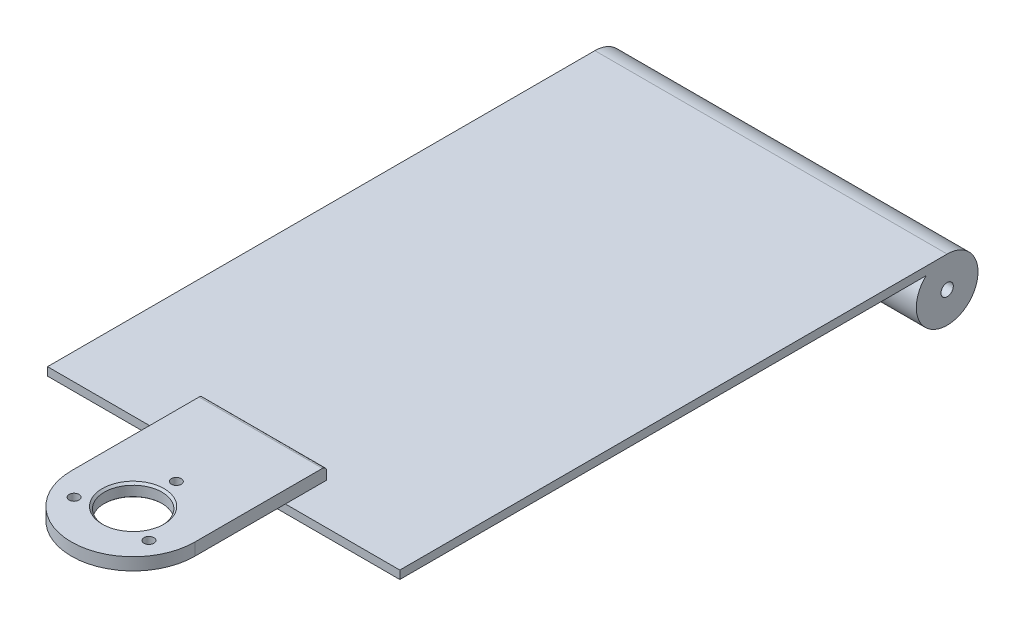
ISO-10303-21;
HEADER;
FILE_DESCRIPTION(('STEP AP214'),'2;1');
FILE_NAME('part.step','',(''),(''),'','','');
FILE_SCHEMA(('AUTOMOTIVE_DESIGN { 1 0 10303 214 1 1 1 1 }'));
ENDSEC;
DATA;
#1=APPLICATION_CONTEXT('core data for automotive mechanical design processes');
#2=APPLICATION_PROTOCOL_DEFINITION('international standard','automotive_design',2000,#1);
#3=PRODUCT_CONTEXT('',#1,'mechanical');
#4=PRODUCT('Part','Part','',(#3));
#5=PRODUCT_RELATED_PRODUCT_CATEGORY('part','',(#4));
#6=PRODUCT_DEFINITION_FORMATION('','',#4);
#7=PRODUCT_DEFINITION_CONTEXT('part definition',#1,'design');
#8=PRODUCT_DEFINITION('design','',#6,#7);
#9=PRODUCT_DEFINITION_SHAPE('','',#8);
#10=(LENGTH_UNIT() NAMED_UNIT(*) SI_UNIT(.MILLI.,.METRE.));
#11=(NAMED_UNIT(*) PLANE_ANGLE_UNIT() SI_UNIT($,.RADIAN.));
#12=(NAMED_UNIT(*) SI_UNIT($,.STERADIAN.) SOLID_ANGLE_UNIT());
#13=UNCERTAINTY_MEASURE_WITH_UNIT(LENGTH_MEASURE(1.E-05),#10,'distance_accuracy_value','');
#14=(GEOMETRIC_REPRESENTATION_CONTEXT(3) GLOBAL_UNCERTAINTY_ASSIGNED_CONTEXT((#13)) GLOBAL_UNIT_ASSIGNED_CONTEXT((#10,
#11,#12)) REPRESENTATION_CONTEXT('',''));
#15=CARTESIAN_POINT('',(0.,0.,0.));
#16=DIRECTION('',(0.,0.,1.));
#17=DIRECTION('',(1.,0.,0.));
#18=AXIS2_PLACEMENT_3D('',#15,#16,#17);
#19=CARTESIAN_POINT('',(42.8,7.5,0.));
#20=DIRECTION('',(0.,-1.,0.));
#21=DIRECTION('',(0.,0.,-1.));
#22=AXIS2_PLACEMENT_3D('',#19,#20,#21);
#23=PLANE('',#22);
#24=DIRECTION('',(0.,0.,-1.));
#25=VECTOR('',#24,1.);
#26=CARTESIAN_POINT('',(15.,7.49999999999998,133.));
#27=LINE('',#26,#25);
#28=CARTESIAN_POINT('',(15.,7.49999999999998,133.));
#29=VERTEX_POINT('',#28);
#30=CARTESIAN_POINT('',(15.,7.5,123.));
#31=VERTEX_POINT('',#30);
#32=EDGE_CURVE('E134',#29,#31,#27,.T.);
#33=ORIENTED_EDGE('',*,*,#32,.F.);
#34=DIRECTION('',(-1.,0.,0.));
#35=VECTOR('',#34,1.);
#36=CARTESIAN_POINT('',(42.8,7.49999999999998,133.));
#37=LINE('',#36,#35);
#38=CARTESIAN_POINT('',(42.8,7.49999999999998,133.));
#39=VERTEX_POINT('',#38);
#40=EDGE_CURVE('E43',#39,#29,#37,.T.);
#41=ORIENTED_EDGE('',*,*,#40,.F.);
#42=DIRECTION('',(0.,0.,1.));
#43=VECTOR('',#42,1.);
#44=CARTESIAN_POINT('',(42.8,7.5,0.));
#45=LINE('',#44,#43);
#46=CARTESIAN_POINT('',(42.8,7.5,0.));
#47=VERTEX_POINT('',#46);
#48=EDGE_CURVE('E87',#47,#39,#45,.T.);
#49=ORIENTED_EDGE('',*,*,#48,.F.);
#50=DIRECTION('',(-1.,0.,0.));
#51=VECTOR('',#50,1.);
#52=CARTESIAN_POINT('',(42.8,7.5,0.));
#53=LINE('',#52,#51);
#54=CARTESIAN_POINT('',(-42.8,7.5,0.));
#55=VERTEX_POINT('',#54);
#56=EDGE_CURVE('E11',#47,#55,#53,.T.);
#57=ORIENTED_EDGE('',*,*,#56,.T.);
#58=DIRECTION('',(0.,0.,1.));
#59=VECTOR('',#58,1.);
#60=CARTESIAN_POINT('',(-42.8,7.5,0.));
#61=LINE('',#60,#59);
#62=CARTESIAN_POINT('',(-42.8,7.49999999999998,133.));
#63=VERTEX_POINT('',#62);
#64=EDGE_CURVE('E187',#55,#63,#61,.T.);
#65=ORIENTED_EDGE('',*,*,#64,.T.);
#66=CARTESIAN_POINT('',(-15.,7.49999999999998,133.));
#67=VERTEX_POINT('',#66);
#68=EDGE_CURVE('E195',#67,#63,#37,.T.);
#69=ORIENTED_EDGE('',*,*,#68,.F.);
#70=DIRECTION('',(0.,0.,1.));
#71=VECTOR('',#70,1.);
#72=CARTESIAN_POINT('',(-15.,7.49999999999998,133.));
#73=LINE('',#72,#71);
#74=CARTESIAN_POINT('',(-15.,7.5,123.));
#75=VERTEX_POINT('',#74);
#76=EDGE_CURVE('E151',#75,#67,#73,.T.);
#77=ORIENTED_EDGE('',*,*,#76,.F.);
#78=DIRECTION('',(1.,0.,0.));
#79=VECTOR('',#78,1.);
#80=CARTESIAN_POINT('',(-25.4403065089106,7.5,123.));
#81=LINE('',#80,#79);
#82=EDGE_CURVE('E166',#75,#31,#81,.T.);
#83=ORIENTED_EDGE('',*,*,#82,.T.);
#84=EDGE_LOOP('',(#33,#41,#49,#57,#65,#69,#77,#83));
#85=FACE_BOUND('',#84,.T.);
#86=ADVANCED_FACE('F35',(#85),#23,.F.);
#87=CARTESIAN_POINT('',(42.8,0.,0.));
#88=DIRECTION('',(1.,0.,0.));
#89=DIRECTION('',(0.,0.,-1.));
#90=AXIS2_PLACEMENT_3D('',#87,#88,#89);
#91=PLANE('',#90);
#92=CARTESIAN_POINT('',(42.8,0.,0.));
#93=DIRECTION('',(1.,0.,0.));
#94=DIRECTION('',(0.,0.,-1.));
#95=AXIS2_PLACEMENT_3D('',#92,#93,#94);
#96=CIRCLE('',#95,7.5);
#97=CARTESIAN_POINT('',(42.8,5.49999999999999,5.09901951359279));
#98=VERTEX_POINT('',#97);
#99=EDGE_CURVE('E178',#98,#47,#96,.T.);
#100=ORIENTED_EDGE('',*,*,#99,.T.);
#101=ORIENTED_EDGE('',*,*,#48,.T.);
#102=DIRECTION('',(0.,-1.,0.));
#103=VECTOR('',#102,1.);
#104=CARTESIAN_POINT('',(42.8,7.49999999999998,133.));
#105=LINE('',#104,#103);
#106=CARTESIAN_POINT('',(42.8,5.49999999999998,133.));
#107=VERTEX_POINT('',#106);
#108=EDGE_CURVE('E181',#39,#107,#105,.T.);
#109=ORIENTED_EDGE('',*,*,#108,.T.);
#110=DIRECTION('',(0.,0.,-1.));
#111=VECTOR('',#110,1.);
#112=CARTESIAN_POINT('',(42.8,5.49999999999998,133.));
#113=LINE('',#112,#111);
#114=EDGE_CURVE('E59',#107,#98,#113,.T.);
#115=ORIENTED_EDGE('',*,*,#114,.T.);
#116=EDGE_LOOP('',(#100,#101,#109,#115));
#117=FACE_BOUND('',#116,.T.);
#118=CARTESIAN_POINT('',(42.8,0.,0.));
#119=DIRECTION('',(1.,0.,0.));
#120=DIRECTION('',(0.,0.,-1.));
#121=AXIS2_PLACEMENT_3D('',#118,#119,#120);
#122=CIRCLE('',#121,1.5);
#123=CARTESIAN_POINT('',(42.8,0.,-1.5));
#124=VERTEX_POINT('',#123);
#125=EDGE_CURVE('E172',#124,#124,#122,.T.);
#126=ORIENTED_EDGE('',*,*,#125,.F.);
#127=EDGE_LOOP('',(#126));
#128=FACE_BOUND('',#127,.T.);
#129=ADVANCED_FACE('F214',(#117,#128),#91,.T.);
#130=CARTESIAN_POINT('',(-42.8,0.,0.));
#131=DIRECTION('',(1.,0.,0.));
#132=DIRECTION('',(0.,0.,-1.));
#133=AXIS2_PLACEMENT_3D('',#130,#131,#132);
#134=PLANE('',#133);
#135=CARTESIAN_POINT('',(-42.8,0.,0.));
#136=DIRECTION('',(1.,0.,0.));
#137=DIRECTION('',(0.,0.,-1.));
#138=AXIS2_PLACEMENT_3D('',#135,#136,#137);
#139=CIRCLE('',#138,7.5);
#140=CARTESIAN_POINT('',(-42.8,5.49999999999999,5.09901951359279));
#141=VERTEX_POINT('',#140);
#142=EDGE_CURVE('E175',#141,#55,#139,.T.);
#143=ORIENTED_EDGE('',*,*,#142,.F.);
#144=DIRECTION('',(0.,0.,-1.));
#145=VECTOR('',#144,1.);
#146=CARTESIAN_POINT('',(-42.8,5.49999999999998,133.));
#147=LINE('',#146,#145);
#148=CARTESIAN_POINT('',(-42.8,5.49999999999998,133.));
#149=VERTEX_POINT('',#148);
#150=EDGE_CURVE('E80',#149,#141,#147,.T.);
#151=ORIENTED_EDGE('',*,*,#150,.F.);
#152=DIRECTION('',(0.,-1.,0.));
#153=VECTOR('',#152,1.);
#154=CARTESIAN_POINT('',(-42.8,7.49999999999998,133.));
#155=LINE('',#154,#153);
#156=EDGE_CURVE('E190',#63,#149,#155,.T.);
#157=ORIENTED_EDGE('',*,*,#156,.F.);
#158=ORIENTED_EDGE('',*,*,#64,.F.);
#159=EDGE_LOOP('',(#143,#151,#157,#158));
#160=FACE_BOUND('',#159,.T.);
#161=CARTESIAN_POINT('',(-42.8,0.,0.));
#162=DIRECTION('',(1.,0.,0.));
#163=DIRECTION('',(0.,0.,-1.));
#164=AXIS2_PLACEMENT_3D('',#161,#162,#163);
#165=CIRCLE('',#164,1.5);
#166=CARTESIAN_POINT('',(-42.8,0.,-1.5));
#167=VERTEX_POINT('',#166);
#168=EDGE_CURVE('E159',#167,#167,#165,.T.);
#169=ORIENTED_EDGE('',*,*,#168,.T.);
#170=EDGE_LOOP('',(#169));
#171=FACE_BOUND('',#170,.T.);
#172=ADVANCED_FACE('F209',(#160,#171),#134,.F.);
#173=CARTESIAN_POINT('',(42.8,0.,0.));
#174=DIRECTION('',(-1.,0.,0.));
#175=DIRECTION('',(0.,0.,1.));
#176=AXIS2_PLACEMENT_3D('',#173,#174,#175);
#177=CYLINDRICAL_SURFACE('',#176,7.5);
#178=ORIENTED_EDGE('',*,*,#142,.T.);
#179=ORIENTED_EDGE('',*,*,#56,.F.);
#180=ORIENTED_EDGE('',*,*,#99,.F.);
#181=DIRECTION('',(-1.,0.,0.));
#182=VECTOR('',#181,1.);
#183=CARTESIAN_POINT('',(42.8,5.49999999999999,5.09901951359279));
#184=LINE('',#183,#182);
#185=EDGE_CURVE('E184',#98,#141,#184,.T.);
#186=ORIENTED_EDGE('',*,*,#185,.T.);
#187=EDGE_LOOP('',(#178,#179,#180,#186));
#188=FACE_BOUND('',#187,.T.);
#189=ADVANCED_FACE('F37',(#188),#177,.T.);
#190=CARTESIAN_POINT('',(42.8,7.49999999999998,133.));
#191=DIRECTION('',(0.,0.,-1.));
#192=DIRECTION('',(-1.,0.,0.));
#193=AXIS2_PLACEMENT_3D('',#190,#191,#192);
#194=PLANE('',#193);
#195=ORIENTED_EDGE('',*,*,#40,.T.);
#196=DIRECTION('',(-1.,0.,0.));
#197=VECTOR('',#196,1.);
#198=CARTESIAN_POINT('',(15.,7.49999999999998,133.));
#199=LINE('',#198,#197);
#200=EDGE_CURVE('E203',#29,#67,#199,.T.);
#201=ORIENTED_EDGE('',*,*,#200,.T.);
#202=ORIENTED_EDGE('',*,*,#68,.T.);
#203=ORIENTED_EDGE('',*,*,#156,.T.);
#204=DIRECTION('',(-1.,0.,0.));
#205=VECTOR('',#204,1.);
#206=CARTESIAN_POINT('',(42.8,5.49999999999998,133.));
#207=LINE('',#206,#205);
#208=EDGE_CURVE('E194',#107,#149,#207,.T.);
#209=ORIENTED_EDGE('',*,*,#208,.F.);
#210=ORIENTED_EDGE('',*,*,#108,.F.);
#211=EDGE_LOOP('',(#195,#201,#202,#203,#209,#210));
#212=FACE_BOUND('',#211,.T.);
#213=ADVANCED_FACE('F200',(#212),#194,.F.);
#214=CARTESIAN_POINT('',(42.8,5.49999999999998,133.));
#215=DIRECTION('',(0.,1.,0.));
#216=DIRECTION('',(0.,0.,1.));
#217=AXIS2_PLACEMENT_3D('',#214,#215,#216);
#218=PLANE('',#217);
#219=ORIENTED_EDGE('',*,*,#150,.T.);
#220=ORIENTED_EDGE('',*,*,#185,.F.);
#221=ORIENTED_EDGE('',*,*,#114,.F.);
#222=ORIENTED_EDGE('',*,*,#208,.T.);
#223=EDGE_LOOP('',(#219,#220,#221,#222));
#224=FACE_BOUND('',#223,.T.);
#225=ADVANCED_FACE('F213',(#224),#218,.F.);
#226=CARTESIAN_POINT('',(42.8,0.,0.));
#227=DIRECTION('',(-1.,0.,0.));
#228=DIRECTION('',(0.,0.,1.));
#229=AXIS2_PLACEMENT_3D('',#226,#227,#228);
#230=CYLINDRICAL_SURFACE('',#229,1.5);
#231=ORIENTED_EDGE('',*,*,#125,.T.);
#232=EDGE_LOOP('',(#231));
#233=FACE_BOUND('',#232,.T.);
#234=ORIENTED_EDGE('',*,*,#168,.F.);
#235=EDGE_LOOP('',(#234));
#236=FACE_BOUND('',#235,.T.);
#237=ADVANCED_FACE('F309',(#233,#236),#230,.F.);
#238=CARTESIAN_POINT('',(-25.4403065089106,10.5,133.));
#239=DIRECTION('',(0.,1.,0.));
#240=DIRECTION('',(0.,0.,1.));
#241=AXIS2_PLACEMENT_3D('',#238,#239,#240);
#242=PLANE('',#241);
#243=CARTESIAN_POINT('',(0.,10.5,155.));
#244=DIRECTION('',(0.,-1.,0.));
#245=DIRECTION('',(0.,0.,-1.));
#246=AXIS2_PLACEMENT_3D('',#243,#244,#245);
#247=CIRCLE('',#246,7.50000000000001);
#248=CARTESIAN_POINT('',(0.,10.5,147.5));
#249=VERTEX_POINT('',#248);
#250=EDGE_CURVE('E255',#249,#249,#247,.T.);
#251=ORIENTED_EDGE('',*,*,#250,.T.);
#252=EDGE_LOOP('',(#251));
#253=FACE_BOUND('',#252,.T.);
#254=CARTESIAN_POINT('',(0.,10.5,144.5));
#255=DIRECTION('',(0.,1.,0.));
#256=DIRECTION('',(0.,0.,1.));
#257=AXIS2_PLACEMENT_3D('',#254,#255,#256);
#258=CIRCLE('',#257,1.2);
#259=CARTESIAN_POINT('',(0.,10.5,145.7));
#260=VERTEX_POINT('',#259);
#261=EDGE_CURVE('E222',#260,#260,#258,.T.);
#262=ORIENTED_EDGE('',*,*,#261,.F.);
#263=EDGE_LOOP('',(#262));
#264=FACE_BOUND('',#263,.T.);
#265=CARTESIAN_POINT('',(9.09326673973704,10.5,160.25));
#266=DIRECTION('',(0.,1.,0.));
#267=DIRECTION('',(0.,0.,1.));
#268=AXIS2_PLACEMENT_3D('',#265,#266,#267);
#269=CIRCLE('',#268,1.19999999999999);
#270=CARTESIAN_POINT('',(9.09326673973704,10.5,161.45));
#271=VERTEX_POINT('',#270);
#272=EDGE_CURVE('E227',#271,#271,#269,.T.);
#273=ORIENTED_EDGE('',*,*,#272,.F.);
#274=EDGE_LOOP('',(#273));
#275=FACE_BOUND('',#274,.T.);
#276=CARTESIAN_POINT('',(-9.0932667397362,10.5,160.25));
#277=DIRECTION('',(0.,1.,0.));
#278=DIRECTION('',(0.,0.,1.));
#279=AXIS2_PLACEMENT_3D('',#276,#277,#278);
#280=CIRCLE('',#279,1.20000000000001);
#281=CARTESIAN_POINT('',(-9.0932667397362,10.5,161.45));
#282=VERTEX_POINT('',#281);
#283=EDGE_CURVE('E224',#282,#282,#280,.T.);
#284=ORIENTED_EDGE('',*,*,#283,.F.);
#285=EDGE_LOOP('',(#284));
#286=FACE_BOUND('',#285,.T.);
#287=DIRECTION('',(0.,0.,-1.));
#288=VECTOR('',#287,1.);
#289=CARTESIAN_POINT('',(-15.,10.5,133.));
#290=LINE('',#289,#288);
#291=CARTESIAN_POINT('',(-15.,10.5,155.));
#292=VERTEX_POINT('',#291);
#293=CARTESIAN_POINT('',(-15.,10.5,124.));
#294=VERTEX_POINT('',#293);
#295=EDGE_CURVE('E139',#292,#294,#290,.T.);
#296=ORIENTED_EDGE('',*,*,#295,.F.);
#297=CARTESIAN_POINT('',(0.,10.5,155.));
#298=DIRECTION('',(0.,1.,0.));
#299=DIRECTION('',(0.,0.,1.));
#300=AXIS2_PLACEMENT_3D('',#297,#298,#299);
#301=CIRCLE('',#300,15.);
#302=CARTESIAN_POINT('',(15.,10.5,155.));
#303=VERTEX_POINT('',#302);
#304=EDGE_CURVE('E137',#292,#303,#301,.T.);
#305=ORIENTED_EDGE('',*,*,#304,.T.);
#306=DIRECTION('',(0.,0.,1.));
#307=VECTOR('',#306,1.);
#308=CARTESIAN_POINT('',(15.,10.5,133.));
#309=LINE('',#308,#307);
#310=CARTESIAN_POINT('',(15.,10.5,124.));
#311=VERTEX_POINT('',#310);
#312=EDGE_CURVE('E123',#311,#303,#309,.T.);
#313=ORIENTED_EDGE('',*,*,#312,.F.);
#314=DIRECTION('',(1.,0.,0.));
#315=VECTOR('',#314,1.);
#316=CARTESIAN_POINT('',(-25.4403065089106,10.5,124.));
#317=LINE('',#316,#315);
#318=EDGE_CURVE('E155',#294,#311,#317,.T.);
#319=ORIENTED_EDGE('',*,*,#318,.F.);
#320=EDGE_LOOP('',(#296,#305,#313,#319));
#321=FACE_BOUND('',#320,.T.);
#322=ADVANCED_FACE('F138',(#253,#264,#275,#286,#321),#242,.T.);
#323=CARTESIAN_POINT('',(-25.4403065089106,9.49999999999998,124.));
#324=DIRECTION('',(1.,0.,0.));
#325=DIRECTION('',(0.,0.,-1.));
#326=AXIS2_PLACEMENT_3D('',#323,#324,#325);
#327=CYLINDRICAL_SURFACE('',#326,1.);
#328=CARTESIAN_POINT('',(-15.,9.49999999999998,124.));
#329=DIRECTION('',(1.,0.,0.));
#330=DIRECTION('',(0.,0.,-1.));
#331=AXIS2_PLACEMENT_3D('',#328,#329,#330);
#332=CIRCLE('',#331,1.);
#333=CARTESIAN_POINT('',(-15.,9.49999999999998,123.));
#334=VERTEX_POINT('',#333);
#335=EDGE_CURVE('E157',#294,#334,#332,.F.);
#336=ORIENTED_EDGE('',*,*,#335,.F.);
#337=ORIENTED_EDGE('',*,*,#318,.T.);
#338=CARTESIAN_POINT('',(15.,9.49999999999998,124.));
#339=DIRECTION('',(1.,0.,0.));
#340=DIRECTION('',(0.,0.,1.));
#341=AXIS2_PLACEMENT_3D('',#338,#339,#340);
#342=CIRCLE('',#341,1.);
#343=CARTESIAN_POINT('',(15.,9.49999999999998,123.));
#344=VERTEX_POINT('',#343);
#345=EDGE_CURVE('E131',#344,#311,#342,.T.);
#346=ORIENTED_EDGE('',*,*,#345,.F.);
#347=DIRECTION('',(1.,0.,0.));
#348=VECTOR('',#347,1.);
#349=CARTESIAN_POINT('',(-25.4403065089106,9.49999999999998,123.));
#350=LINE('',#349,#348);
#351=EDGE_CURVE('E168',#334,#344,#350,.T.);
#352=ORIENTED_EDGE('',*,*,#351,.F.);
#353=EDGE_LOOP('',(#336,#337,#346,#352));
#354=FACE_BOUND('',#353,.T.);
#355=ADVANCED_FACE('F317',(#354),#327,.T.);
#356=CARTESIAN_POINT('',(-25.4403065089106,9.49999999999998,123.));
#357=DIRECTION('',(0.,0.,-1.));
#358=DIRECTION('',(-1.,0.,0.));
#359=AXIS2_PLACEMENT_3D('',#356,#357,#358);
#360=PLANE('',#359);
#361=DIRECTION('',(0.,-1.,0.));
#362=VECTOR('',#361,1.);
#363=CARTESIAN_POINT('',(-15.,9.49999999999998,123.));
#364=LINE('',#363,#362);
#365=EDGE_CURVE('E154',#334,#75,#364,.T.);
#366=ORIENTED_EDGE('',*,*,#365,.F.);
#367=ORIENTED_EDGE('',*,*,#351,.T.);
#368=DIRECTION('',(0.,1.,0.));
#369=VECTOR('',#368,1.);
#370=CARTESIAN_POINT('',(15.,9.49999999999998,123.));
#371=LINE('',#370,#369);
#372=EDGE_CURVE('E163',#31,#344,#371,.T.);
#373=ORIENTED_EDGE('',*,*,#372,.F.);
#374=ORIENTED_EDGE('',*,*,#82,.F.);
#375=EDGE_LOOP('',(#366,#367,#373,#374));
#376=FACE_BOUND('',#375,.T.);
#377=ADVANCED_FACE('F319',(#376),#360,.T.);
#378=CARTESIAN_POINT('',(15.,9.49999999999998,124.));
#379=DIRECTION('',(-1.,0.,0.));
#380=DIRECTION('',(0.,0.,1.));
#381=AXIS2_PLACEMENT_3D('',#378,#379,#380);
#382=PLANE('',#381);
#383=ORIENTED_EDGE('',*,*,#312,.T.);
#384=DIRECTION('',(0.,-1.,0.));
#385=VECTOR('',#384,1.);
#386=CARTESIAN_POINT('',(15.,10.5,155.));
#387=LINE('',#386,#385);
#388=CARTESIAN_POINT('',(15.,7.49999999999998,155.));
#389=VERTEX_POINT('',#388);
#390=EDGE_CURVE('E127',#303,#389,#387,.T.);
#391=ORIENTED_EDGE('',*,*,#390,.T.);
#392=DIRECTION('',(0.,0.,-1.));
#393=VECTOR('',#392,1.);
#394=CARTESIAN_POINT('',(15.,7.49999999999998,155.));
#395=LINE('',#394,#393);
#396=EDGE_CURVE('E217',#389,#29,#395,.T.);
#397=ORIENTED_EDGE('',*,*,#396,.T.);
#398=ORIENTED_EDGE('',*,*,#32,.T.);
#399=ORIENTED_EDGE('',*,*,#372,.T.);
#400=ORIENTED_EDGE('',*,*,#345,.T.);
#401=EDGE_LOOP('',(#383,#391,#397,#398,#399,#400));
#402=FACE_BOUND('',#401,.T.);
#403=ADVANCED_FACE('F125',(#402),#382,.F.);
#404=CARTESIAN_POINT('',(-15.,10.5,133.));
#405=DIRECTION('',(1.,0.,0.));
#406=DIRECTION('',(0.,0.,-1.));
#407=AXIS2_PLACEMENT_3D('',#404,#405,#406);
#408=PLANE('',#407);
#409=ORIENTED_EDGE('',*,*,#295,.T.);
#410=ORIENTED_EDGE('',*,*,#335,.T.);
#411=ORIENTED_EDGE('',*,*,#365,.T.);
#412=ORIENTED_EDGE('',*,*,#76,.T.);
#413=DIRECTION('',(0.,0.,1.));
#414=VECTOR('',#413,1.);
#415=CARTESIAN_POINT('',(-15.,7.49999999999998,133.));
#416=LINE('',#415,#414);
#417=CARTESIAN_POINT('',(-15.,7.49999999999998,155.));
#418=VERTEX_POINT('',#417);
#419=EDGE_CURVE('E50',#67,#418,#416,.T.);
#420=ORIENTED_EDGE('',*,*,#419,.T.);
#421=DIRECTION('',(0.,-1.,0.));
#422=VECTOR('',#421,1.);
#423=CARTESIAN_POINT('',(-15.,10.5,155.));
#424=LINE('',#423,#422);
#425=EDGE_CURVE('E143',#292,#418,#424,.T.);
#426=ORIENTED_EDGE('',*,*,#425,.F.);
#427=EDGE_LOOP('',(#409,#410,#411,#412,#420,#426));
#428=FACE_BOUND('',#427,.T.);
#429=ADVANCED_FACE('F328',(#428),#408,.F.);
#430=CARTESIAN_POINT('',(0.,10.5,155.));
#431=DIRECTION('',(0.,-1.,0.));
#432=DIRECTION('',(0.,0.,-1.));
#433=AXIS2_PLACEMENT_3D('',#430,#431,#432);
#434=CYLINDRICAL_SURFACE('',#433,15.);
#435=CARTESIAN_POINT('',(0.,7.49999999999998,155.));
#436=DIRECTION('',(0.,1.,0.));
#437=DIRECTION('',(0.,0.,1.));
#438=AXIS2_PLACEMENT_3D('',#435,#436,#437);
#439=CIRCLE('',#438,15.);
#440=EDGE_CURVE('E146',#418,#389,#439,.T.);
#441=ORIENTED_EDGE('',*,*,#440,.T.);
#442=ORIENTED_EDGE('',*,*,#390,.F.);
#443=ORIENTED_EDGE('',*,*,#304,.F.);
#444=ORIENTED_EDGE('',*,*,#425,.T.);
#445=EDGE_LOOP('',(#441,#442,#443,#444));
#446=FACE_BOUND('',#445,.T.);
#447=ADVANCED_FACE('F145',(#446),#434,.T.);
#448=CARTESIAN_POINT('',(0.,7.49999999999998,155.));
#449=DIRECTION('',(0.,1.,0.));
#450=DIRECTION('',(0.,0.,1.));
#451=AXIS2_PLACEMENT_3D('',#448,#449,#450);
#452=PLANE('',#451);
#453=CARTESIAN_POINT('',(0.,7.49999999999998,155.));
#454=DIRECTION('',(0.,-1.,0.));
#455=DIRECTION('',(0.,0.,-1.));
#456=AXIS2_PLACEMENT_3D('',#453,#454,#455);
#457=CIRCLE('',#456,7.1);
#458=CARTESIAN_POINT('',(0.,7.49999999999998,147.9));
#459=VERTEX_POINT('',#458);
#460=EDGE_CURVE('E250',#459,#459,#457,.T.);
#461=ORIENTED_EDGE('',*,*,#460,.F.);
#462=EDGE_LOOP('',(#461));
#463=FACE_BOUND('',#462,.T.);
#464=CARTESIAN_POINT('',(9.09326673973665,7.49999999999998,160.25));
#465=DIRECTION('',(0.,1.,0.));
#466=DIRECTION('',(-0.866025403784443,0.,-0.499999999999992));
#467=AXIS2_PLACEMENT_3D('',#464,#465,#466);
#468=CIRCLE('',#467,2.5);
#469=CARTESIAN_POINT('',(6.92820323027554,7.49999999999998,159.));
#470=VERTEX_POINT('',#469);
#471=EDGE_CURVE('E244',#470,#470,#468,.T.);
#472=ORIENTED_EDGE('',*,*,#471,.T.);
#473=EDGE_LOOP('',(#472));
#474=FACE_BOUND('',#473,.T.);
#475=CARTESIAN_POINT('',(-9.09326673973659,7.49999999999998,160.25));
#476=DIRECTION('',(0.,1.,0.));
#477=DIRECTION('',(0.866025403784436,0.,-0.500000000000004));
#478=AXIS2_PLACEMENT_3D('',#475,#476,#477);
#479=CIRCLE('',#478,2.5);
#480=CARTESIAN_POINT('',(-6.9282032302755,7.49999999999998,159.));
#481=VERTEX_POINT('',#480);
#482=EDGE_CURVE('E238',#481,#481,#479,.T.);
#483=ORIENTED_EDGE('',*,*,#482,.T.);
#484=EDGE_LOOP('',(#483));
#485=FACE_BOUND('',#484,.T.);
#486=CARTESIAN_POINT('',(0.,7.49999999999998,144.5));
#487=DIRECTION('',(0.,1.,0.));
#488=DIRECTION('',(0.,0.,1.));
#489=AXIS2_PLACEMENT_3D('',#486,#487,#488);
#490=CIRCLE('',#489,2.5);
#491=CARTESIAN_POINT('',(0.,7.49999999999998,147.));
#492=VERTEX_POINT('',#491);
#493=EDGE_CURVE('E228',#492,#492,#490,.T.);
#494=ORIENTED_EDGE('',*,*,#493,.T.);
#495=EDGE_LOOP('',(#494));
#496=FACE_BOUND('',#495,.T.);
#497=ORIENTED_EDGE('',*,*,#440,.F.);
#498=ORIENTED_EDGE('',*,*,#419,.F.);
#499=ORIENTED_EDGE('',*,*,#200,.F.);
#500=ORIENTED_EDGE('',*,*,#396,.F.);
#501=EDGE_LOOP('',(#497,#498,#499,#500));
#502=FACE_BOUND('',#501,.T.);
#503=ADVANCED_FACE('F219',(#463,#474,#485,#496,#502),#452,.F.);
#504=CARTESIAN_POINT('',(-9.0932667397362,10.4,160.25));
#505=DIRECTION('',(0.,1.,0.));
#506=DIRECTION('',(0.,0.,1.));
#507=AXIS2_PLACEMENT_3D('',#504,#505,#506);
#508=CYLINDRICAL_SURFACE('',#507,1.20000000000001);
#509=ORIENTED_EDGE('',*,*,#283,.T.);
#510=EDGE_LOOP('',(#509));
#511=FACE_BOUND('',#510,.T.);
#512=CARTESIAN_POINT('',(-9.09326673973659,8.79999999999995,160.25));
#513=DIRECTION('',(0.,1.,0.));
#514=DIRECTION('',(0.866025403784436,0.,-0.500000000000004));
#515=AXIS2_PLACEMENT_3D('',#512,#513,#514);
#516=CIRCLE('',#515,1.20000000000001);
#517=CARTESIAN_POINT('',(-8.05403625519526,8.79999999999995,159.65));
#518=VERTEX_POINT('',#517);
#519=EDGE_CURVE('E241',#518,#518,#516,.T.);
#520=ORIENTED_EDGE('',*,*,#519,.F.);
#521=EDGE_LOOP('',(#520));
#522=FACE_BOUND('',#521,.T.);
#523=ADVANCED_FACE('F275',(#511,#522),#508,.F.);
#524=CARTESIAN_POINT('',(9.09326673973704,10.4,160.25));
#525=DIRECTION('',(0.,1.,0.));
#526=DIRECTION('',(0.,0.,1.));
#527=AXIS2_PLACEMENT_3D('',#524,#525,#526);
#528=CYLINDRICAL_SURFACE('',#527,1.19999999999999);
#529=ORIENTED_EDGE('',*,*,#272,.T.);
#530=EDGE_LOOP('',(#529));
#531=FACE_BOUND('',#530,.T.);
#532=CARTESIAN_POINT('',(9.09326673973665,8.79999999999995,160.25));
#533=DIRECTION('',(0.,1.,0.));
#534=DIRECTION('',(-0.866025403784443,0.,-0.499999999999992));
#535=AXIS2_PLACEMENT_3D('',#532,#533,#534);
#536=CIRCLE('',#535,1.20000000000001);
#537=CARTESIAN_POINT('',(8.05403625519531,8.79999999999995,159.65));
#538=VERTEX_POINT('',#537);
#539=EDGE_CURVE('E247',#538,#538,#536,.T.);
#540=ORIENTED_EDGE('',*,*,#539,.F.);
#541=EDGE_LOOP('',(#540));
#542=FACE_BOUND('',#541,.T.);
#543=ADVANCED_FACE('F296',(#531,#542),#528,.F.);
#544=CARTESIAN_POINT('',(0.,10.4,144.5));
#545=DIRECTION('',(0.,1.,0.));
#546=DIRECTION('',(0.,0.,1.));
#547=AXIS2_PLACEMENT_3D('',#544,#545,#546);
#548=CYLINDRICAL_SURFACE('',#547,1.2);
#549=ORIENTED_EDGE('',*,*,#261,.T.);
#550=EDGE_LOOP('',(#549));
#551=FACE_BOUND('',#550,.T.);
#552=CARTESIAN_POINT('',(0.,8.79999999999995,144.5));
#553=DIRECTION('',(0.,1.,0.));
#554=DIRECTION('',(0.,0.,1.));
#555=AXIS2_PLACEMENT_3D('',#552,#553,#554);
#556=CIRCLE('',#555,1.20000000000001);
#557=CARTESIAN_POINT('',(0.,8.79999999999995,145.7));
#558=VERTEX_POINT('',#557);
#559=EDGE_CURVE('E235',#558,#558,#556,.T.);
#560=ORIENTED_EDGE('',*,*,#559,.F.);
#561=EDGE_LOOP('',(#560));
#562=FACE_BOUND('',#561,.T.);
#563=ADVANCED_FACE('F286',(#551,#562),#548,.F.);
#564=CARTESIAN_POINT('',(0.,7.49999999999998,144.5));
#565=DIRECTION('',(0.,-1.,0.));
#566=DIRECTION('',(0.,0.,-1.));
#567=AXIS2_PLACEMENT_3D('',#564,#565,#566);
#568=CONICAL_SURFACE('',#567,2.5,0.785398163397458);
#569=ORIENTED_EDGE('',*,*,#559,.T.);
#570=EDGE_LOOP('',(#569));
#571=FACE_BOUND('',#570,.T.);
#572=ORIENTED_EDGE('',*,*,#493,.F.);
#573=EDGE_LOOP('',(#572));
#574=FACE_BOUND('',#573,.T.);
#575=ADVANCED_FACE('F283',(#571,#574),#568,.F.);
#576=CARTESIAN_POINT('',(-9.09326673973659,7.49999999999998,160.25));
#577=DIRECTION('',(0.,-1.,0.));
#578=DIRECTION('',(-0.866025403784436,0.,0.500000000000004));
#579=AXIS2_PLACEMENT_3D('',#576,#577,#578);
#580=CONICAL_SURFACE('',#579,2.5,0.785398163397458);
#581=ORIENTED_EDGE('',*,*,#519,.T.);
#582=EDGE_LOOP('',(#581));
#583=FACE_BOUND('',#582,.T.);
#584=ORIENTED_EDGE('',*,*,#482,.F.);
#585=EDGE_LOOP('',(#584));
#586=FACE_BOUND('',#585,.T.);
#587=ADVANCED_FACE('F285',(#583,#586),#580,.F.);
#588=CARTESIAN_POINT('',(9.09326673973665,7.49999999999998,160.25));
#589=DIRECTION('',(0.,-1.,0.));
#590=DIRECTION('',(0.866025403784443,0.,0.499999999999992));
#591=AXIS2_PLACEMENT_3D('',#588,#589,#590);
#592=CONICAL_SURFACE('',#591,2.5,0.785398163397458);
#593=ORIENTED_EDGE('',*,*,#539,.T.);
#594=EDGE_LOOP('',(#593));
#595=FACE_BOUND('',#594,.T.);
#596=ORIENTED_EDGE('',*,*,#471,.F.);
#597=EDGE_LOOP('',(#596));
#598=FACE_BOUND('',#597,.T.);
#599=ADVANCED_FACE('F293',(#595,#598),#592,.F.);
#600=CARTESIAN_POINT('',(0.,9.99999999999998,155.));
#601=DIRECTION('',(0.,1.,0.));
#602=DIRECTION('',(0.,0.,1.));
#603=AXIS2_PLACEMENT_3D('',#600,#601,#602);
#604=CONICAL_SURFACE('',#603,7.00000000000001,0.785398163397447);
#605=ORIENTED_EDGE('',*,*,#250,.F.);
#606=EDGE_LOOP('',(#605));
#607=FACE_BOUND('',#606,.T.);
#608=CARTESIAN_POINT('',(0.,9.99999999999998,155.));
#609=DIRECTION('',(0.,-1.,0.));
#610=DIRECTION('',(0.,0.,-1.));
#611=AXIS2_PLACEMENT_3D('',#608,#609,#610);
#612=CIRCLE('',#611,7.00000000000001);
#613=CARTESIAN_POINT('',(0.,9.99999999999998,148.));
#614=VERTEX_POINT('',#613);
#615=EDGE_CURVE('E251',#614,#614,#612,.T.);
#616=ORIENTED_EDGE('',*,*,#615,.T.);
#617=EDGE_LOOP('',(#616));
#618=FACE_BOUND('',#617,.T.);
#619=ADVANCED_FACE('F269',(#607,#618),#604,.F.);
#620=CARTESIAN_POINT('',(0.,7.49999999999998,155.));
#621=DIRECTION('',(0.,-1.,0.));
#622=DIRECTION('',(0.,0.,-1.));
#623=AXIS2_PLACEMENT_3D('',#620,#621,#622);
#624=CONICAL_SURFACE('',#623,7.1,0.785398163397414);
#625=CARTESIAN_POINT('',(0.,7.59999999999998,155.));
#626=DIRECTION('',(0.,-1.,0.));
#627=DIRECTION('',(0.,0.,-1.));
#628=AXIS2_PLACEMENT_3D('',#625,#626,#627);
#629=CIRCLE('',#628,7.00000000000001);
#630=CARTESIAN_POINT('',(0.,7.59999999999998,148.));
#631=VERTEX_POINT('',#630);
#632=EDGE_CURVE('E254',#631,#631,#629,.T.);
#633=ORIENTED_EDGE('',*,*,#632,.F.);
#634=EDGE_LOOP('',(#633));
#635=FACE_BOUND('',#634,.T.);
#636=ORIENTED_EDGE('',*,*,#460,.T.);
#637=EDGE_LOOP('',(#636));
#638=FACE_BOUND('',#637,.T.);
#639=ADVANCED_FACE('F266',(#635,#638),#624,.F.);
#640=CARTESIAN_POINT('',(0.,-7.501,155.));
#641=DIRECTION('',(0.,1.,0.));
#642=DIRECTION('',(0.,0.,1.));
#643=AXIS2_PLACEMENT_3D('',#640,#641,#642);
#644=CYLINDRICAL_SURFACE('',#643,7.);
#645=ORIENTED_EDGE('',*,*,#632,.T.);
#646=EDGE_LOOP('',(#645));
#647=FACE_BOUND('',#646,.T.);
#648=ORIENTED_EDGE('',*,*,#615,.F.);
#649=EDGE_LOOP('',(#648));
#650=FACE_BOUND('',#649,.T.);
#651=ADVANCED_FACE('F263',(#647,#650),#644,.F.);
#652=CLOSED_SHELL('',(#86,#129,#172,#189,#213,#225,#237,#322,#355,#377,#403,#429,#447,#503,#523,
#543,#563,#575,#587,#599,#619,#639,#651));
#653=MANIFOLD_SOLID_BREP('B2',#652);
#654=ADVANCED_BREP_SHAPE_REPRESENTATION('',(#18,#653),#14);
#655=SHAPE_DEFINITION_REPRESENTATION(#9,#654);
ENDSEC;
END-ISO-10303-21;
